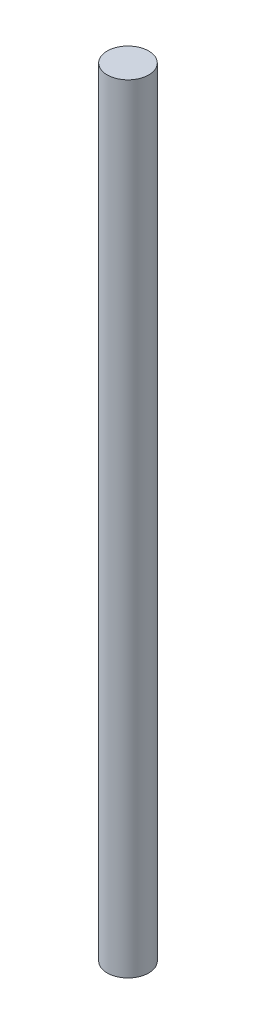
ISO-10303-21;
HEADER;
FILE_DESCRIPTION(('STEP AP214'),'2;1');
FILE_NAME('part.step','',(''),(''),'','','');
FILE_SCHEMA(('AUTOMOTIVE_DESIGN { 1 0 10303 214 1 1 1 1 }'));
ENDSEC;
DATA;
#1=APPLICATION_CONTEXT('core data for automotive mechanical design processes');
#2=APPLICATION_PROTOCOL_DEFINITION('international standard','automotive_design',2000,#1);
#3=PRODUCT_CONTEXT('',#1,'mechanical');
#4=PRODUCT('Part','Part','',(#3));
#5=PRODUCT_RELATED_PRODUCT_CATEGORY('part','',(#4));
#6=PRODUCT_DEFINITION_FORMATION('','',#4);
#7=PRODUCT_DEFINITION_CONTEXT('part definition',#1,'design');
#8=PRODUCT_DEFINITION('design','',#6,#7);
#9=PRODUCT_DEFINITION_SHAPE('','',#8);
#10=(LENGTH_UNIT() NAMED_UNIT(*) SI_UNIT(.MILLI.,.METRE.));
#11=(NAMED_UNIT(*) PLANE_ANGLE_UNIT() SI_UNIT($,.RADIAN.));
#12=(NAMED_UNIT(*) SI_UNIT($,.STERADIAN.) SOLID_ANGLE_UNIT());
#13=UNCERTAINTY_MEASURE_WITH_UNIT(LENGTH_MEASURE(1.E-05),#10,'distance_accuracy_value','');
#14=(GEOMETRIC_REPRESENTATION_CONTEXT(3) GLOBAL_UNCERTAINTY_ASSIGNED_CONTEXT((#13)) GLOBAL_UNIT_ASSIGNED_CONTEXT((#10,
#11,#12)) REPRESENTATION_CONTEXT('',''));
#15=CARTESIAN_POINT('',(0.,0.,0.));
#16=DIRECTION('',(0.,0.,1.));
#17=DIRECTION('',(1.,0.,0.));
#18=AXIS2_PLACEMENT_3D('',#15,#16,#17);
#19=CARTESIAN_POINT('',(0.,300.,0.));
#20=DIRECTION('',(0.,-1.,0.));
#21=DIRECTION('',(0.,0.,-1.));
#22=AXIS2_PLACEMENT_3D('',#19,#20,#21);
#23=CYLINDRICAL_SURFACE('',#22,8.);
#24=CARTESIAN_POINT('',(0.,300.,0.));
#25=DIRECTION('',(0.,1.,0.));
#26=DIRECTION('',(0.,0.,1.));
#27=AXIS2_PLACEMENT_3D('',#24,#25,#26);
#28=CIRCLE('',#27,8.);
#29=CARTESIAN_POINT('',(0.,300.,8.));
#30=VERTEX_POINT('',#29);
#31=EDGE_CURVE('E10',#30,#30,#28,.T.);
#32=ORIENTED_EDGE('',*,*,#31,.F.);
#33=EDGE_LOOP('',(#32));
#34=FACE_BOUND('',#33,.T.);
#35=CARTESIAN_POINT('',(0.,0.,0.));
#36=DIRECTION('',(0.,1.,0.));
#37=DIRECTION('',(0.,0.,1.));
#38=AXIS2_PLACEMENT_3D('',#35,#36,#37);
#39=CIRCLE('',#38,8.);
#40=CARTESIAN_POINT('',(0.,0.,8.));
#41=VERTEX_POINT('',#40);
#42=EDGE_CURVE('E34',#41,#41,#39,.T.);
#43=ORIENTED_EDGE('',*,*,#42,.T.);
#44=EDGE_LOOP('',(#43));
#45=FACE_BOUND('',#44,.T.);
#46=ADVANCED_FACE('F31',(#34,#45),#23,.T.);
#47=CARTESIAN_POINT('',(0.,300.,0.));
#48=DIRECTION('',(0.,1.,0.));
#49=DIRECTION('',(0.,0.,1.));
#50=AXIS2_PLACEMENT_3D('',#47,#48,#49);
#51=PLANE('',#50);
#52=ORIENTED_EDGE('',*,*,#31,.T.);
#53=EDGE_LOOP('',(#52));
#54=FACE_BOUND('',#53,.T.);
#55=ADVANCED_FACE('F46',(#54),#51,.T.);
#56=CARTESIAN_POINT('',(0.,0.,0.));
#57=DIRECTION('',(0.,1.,0.));
#58=DIRECTION('',(0.,0.,1.));
#59=AXIS2_PLACEMENT_3D('',#56,#57,#58);
#60=PLANE('',#59);
#61=ORIENTED_EDGE('',*,*,#42,.F.);
#62=EDGE_LOOP('',(#61));
#63=FACE_BOUND('',#62,.T.);
#64=ADVANCED_FACE('F44',(#63),#60,.F.);
#65=CLOSED_SHELL('',(#46,#55,#64));
#66=MANIFOLD_SOLID_BREP('B2',#65);
#67=ADVANCED_BREP_SHAPE_REPRESENTATION('',(#18,#66),#14);
#68=SHAPE_DEFINITION_REPRESENTATION(#9,#67);
ENDSEC;
END-ISO-10303-21;
